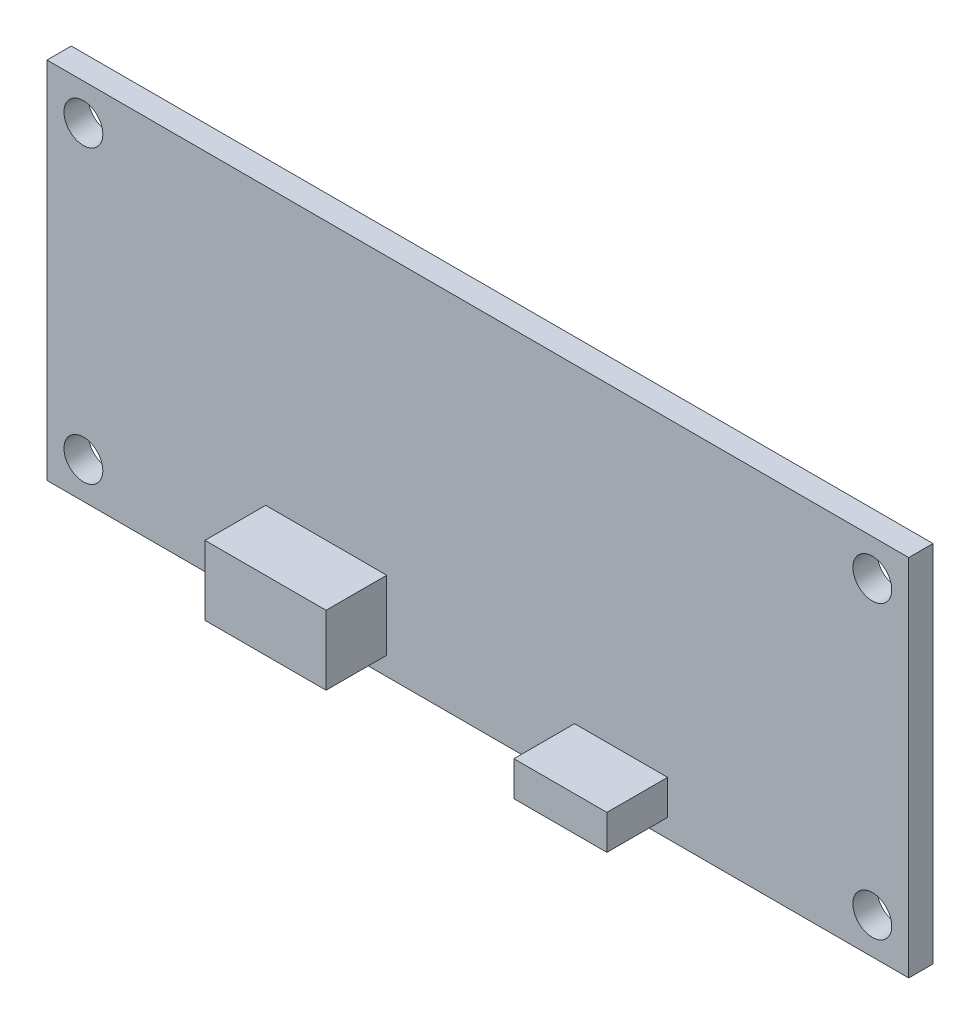
ISO-10303-21;
HEADER;
FILE_DESCRIPTION(('STEP AP214'),'2;1');
FILE_NAME('part.step','',(''),(''),'','','');
FILE_SCHEMA(('AUTOMOTIVE_DESIGN { 1 0 10303 214 1 1 1 1 }'));
ENDSEC;
DATA;
#1=APPLICATION_CONTEXT('core data for automotive mechanical design processes');
#2=APPLICATION_PROTOCOL_DEFINITION('international standard','automotive_design',2000,#1);
#3=PRODUCT_CONTEXT('',#1,'mechanical');
#4=PRODUCT('Part','Part','',(#3));
#5=PRODUCT_RELATED_PRODUCT_CATEGORY('part','',(#4));
#6=PRODUCT_DEFINITION_FORMATION('','',#4);
#7=PRODUCT_DEFINITION_CONTEXT('part definition',#1,'design');
#8=PRODUCT_DEFINITION('design','',#6,#7);
#9=PRODUCT_DEFINITION_SHAPE('','',#8);
#10=(LENGTH_UNIT() NAMED_UNIT(*) SI_UNIT(.MILLI.,.METRE.));
#11=(NAMED_UNIT(*) PLANE_ANGLE_UNIT() SI_UNIT($,.RADIAN.));
#12=(NAMED_UNIT(*) SI_UNIT($,.STERADIAN.) SOLID_ANGLE_UNIT());
#13=UNCERTAINTY_MEASURE_WITH_UNIT(LENGTH_MEASURE(1.E-05),#10,'distance_accuracy_value','');
#14=(GEOMETRIC_REPRESENTATION_CONTEXT(3) GLOBAL_UNCERTAINTY_ASSIGNED_CONTEXT((#13)) GLOBAL_UNIT_ASSIGNED_CONTEXT((#10,
#11,#12)) REPRESENTATION_CONTEXT('',''));
#15=CARTESIAN_POINT('',(0.,0.,0.));
#16=DIRECTION('',(0.,0.,1.));
#17=DIRECTION('',(1.,0.,0.));
#18=AXIS2_PLACEMENT_3D('',#15,#16,#17);
#19=CARTESIAN_POINT('',(0.,0.,2.));
#20=DIRECTION('',(0.,0.,-1.));
#21=DIRECTION('',(-1.,0.,0.));
#22=AXIS2_PLACEMENT_3D('',#19,#20,#21);
#23=PLANE('',#22);
#24=DIRECTION('',(0.,-1.,0.));
#25=VECTOR('',#24,1.);
#26=CARTESIAN_POINT('',(18.0168598681884,7.23542894146016,2.));
#27=LINE('',#26,#25);
#28=CARTESIAN_POINT('',(18.0168598681884,7.23542894146016,2.));
#29=VERTEX_POINT('',#28);
#30=CARTESIAN_POINT('',(18.0168598681884,1.52769789842756,2.));
#31=VERTEX_POINT('',#30);
#32=EDGE_CURVE('E155',#29,#31,#27,.T.);
#33=ORIENTED_EDGE('',*,*,#32,.F.);
#34=DIRECTION('',(-1.,0.,0.));
#35=VECTOR('',#34,1.);
#36=CARTESIAN_POINT('',(18.0168598681884,7.23542894146016,2.));
#37=LINE('',#36,#35);
#38=CARTESIAN_POINT('',(27.9925339433986,7.23542894146016,2.));
#39=VERTEX_POINT('',#38);
#40=EDGE_CURVE('E171',#39,#29,#37,.T.);
#41=ORIENTED_EDGE('',*,*,#40,.F.);
#42=DIRECTION('',(0.,1.,0.));
#43=VECTOR('',#42,1.);
#44=CARTESIAN_POINT('',(27.9925339433986,7.23542894146016,2.));
#45=LINE('',#44,#43);
#46=CARTESIAN_POINT('',(27.9925339433986,1.52769789842756,2.));
#47=VERTEX_POINT('',#46);
#48=EDGE_CURVE('E184',#47,#39,#45,.T.);
#49=ORIENTED_EDGE('',*,*,#48,.F.);
#50=DIRECTION('',(1.,0.,0.));
#51=VECTOR('',#50,1.);
#52=CARTESIAN_POINT('',(18.0168598681884,1.52769789842756,2.));
#53=LINE('',#52,#51);
#54=EDGE_CURVE('E160',#31,#47,#53,.T.);
#55=ORIENTED_EDGE('',*,*,#54,.F.);
#56=EDGE_LOOP('',(#33,#41,#49,#55));
#57=FACE_BOUND('',#56,.T.);
#58=DIRECTION('',(0.,-1.,0.));
#59=VECTOR('',#58,1.);
#60=CARTESIAN_POINT('',(0.,0.,2.));
#61=LINE('',#60,#59);
#62=CARTESIAN_POINT('',(0.,30.,2.));
#63=VERTEX_POINT('',#62);
#64=CARTESIAN_POINT('',(0.,0.,2.));
#65=VERTEX_POINT('',#64);
#66=EDGE_CURVE('E239',#63,#65,#61,.T.);
#67=ORIENTED_EDGE('',*,*,#66,.T.);
#68=DIRECTION('',(1.,0.,0.));
#69=VECTOR('',#68,1.);
#70=CARTESIAN_POINT('',(0.,0.,2.));
#71=LINE('',#70,#69);
#72=CARTESIAN_POINT('',(71.,0.,2.));
#73=VERTEX_POINT('',#72);
#74=EDGE_CURVE('E243',#65,#73,#71,.T.);
#75=ORIENTED_EDGE('',*,*,#74,.T.);
#76=DIRECTION('',(0.,1.,0.));
#77=VECTOR('',#76,1.);
#78=CARTESIAN_POINT('',(71.,0.,2.));
#79=LINE('',#78,#77);
#80=CARTESIAN_POINT('',(71.,30.,2.));
#81=VERTEX_POINT('',#80);
#82=EDGE_CURVE('E247',#73,#81,#79,.T.);
#83=ORIENTED_EDGE('',*,*,#82,.T.);
#84=DIRECTION('',(-1.,0.,0.));
#85=VECTOR('',#84,1.);
#86=CARTESIAN_POINT('',(0.,30.,2.));
#87=LINE('',#86,#85);
#88=EDGE_CURVE('E250',#81,#63,#87,.T.);
#89=ORIENTED_EDGE('',*,*,#88,.T.);
#90=EDGE_LOOP('',(#67,#75,#83,#89));
#91=FACE_BOUND('',#90,.T.);
#92=CARTESIAN_POINT('',(3.,27.,2.));
#93=DIRECTION('',(0.,0.,1.));
#94=DIRECTION('',(1.,0.,0.));
#95=AXIS2_PLACEMENT_3D('',#92,#93,#94);
#96=CIRCLE('',#95,1.6);
#97=CARTESIAN_POINT('',(4.6,27.,2.));
#98=VERTEX_POINT('',#97);
#99=EDGE_CURVE('E231',#98,#98,#96,.T.);
#100=ORIENTED_EDGE('',*,*,#99,.F.);
#101=EDGE_LOOP('',(#100));
#102=FACE_BOUND('',#101,.T.);
#103=CARTESIAN_POINT('',(68.,3.,2.));
#104=DIRECTION('',(0.,0.,1.));
#105=DIRECTION('',(1.,0.,0.));
#106=AXIS2_PLACEMENT_3D('',#103,#104,#105);
#107=CIRCLE('',#106,1.60000000000001);
#108=CARTESIAN_POINT('',(69.6,3.,2.));
#109=VERTEX_POINT('',#108);
#110=EDGE_CURVE('E223',#109,#109,#107,.T.);
#111=ORIENTED_EDGE('',*,*,#110,.F.);
#112=EDGE_LOOP('',(#111));
#113=FACE_BOUND('',#112,.T.);
#114=CARTESIAN_POINT('',(3.,3.,2.));
#115=DIRECTION('',(0.,0.,1.));
#116=DIRECTION('',(1.,0.,0.));
#117=AXIS2_PLACEMENT_3D('',#114,#115,#116);
#118=CIRCLE('',#117,1.6);
#119=CARTESIAN_POINT('',(4.6,3.,2.));
#120=VERTEX_POINT('',#119);
#121=EDGE_CURVE('E215',#120,#120,#118,.T.);
#122=ORIENTED_EDGE('',*,*,#121,.F.);
#123=EDGE_LOOP('',(#122));
#124=FACE_BOUND('',#123,.T.);
#125=CARTESIAN_POINT('',(68.,27.,2.));
#126=DIRECTION('',(0.,0.,1.));
#127=DIRECTION('',(1.,0.,0.));
#128=AXIS2_PLACEMENT_3D('',#125,#126,#127);
#129=CIRCLE('',#128,1.6);
#130=CARTESIAN_POINT('',(69.6,27.,2.));
#131=VERTEX_POINT('',#130);
#132=EDGE_CURVE('E207',#131,#131,#129,.T.);
#133=ORIENTED_EDGE('',*,*,#132,.F.);
#134=EDGE_LOOP('',(#133));
#135=FACE_BOUND('',#134,.T.);
#136=DIRECTION('',(0.,-1.,0.));
#137=VECTOR('',#136,1.);
#138=CARTESIAN_POINT('',(43.4702550600906,4.38156341994386,2.));
#139=LINE('',#138,#137);
#140=CARTESIAN_POINT('',(43.4702550600906,4.38156341994386,2.));
#141=VERTEX_POINT('',#140);
#142=CARTESIAN_POINT('',(43.4702550600906,1.52769789842756,2.));
#143=VERTEX_POINT('',#142);
#144=EDGE_CURVE('E153',#141,#143,#139,.T.);
#145=ORIENTED_EDGE('',*,*,#144,.F.);
#146=DIRECTION('',(-1.,0.,0.));
#147=VECTOR('',#146,1.);
#148=CARTESIAN_POINT('',(43.4702550600906,4.38156341994386,2.));
#149=LINE('',#148,#147);
#150=CARTESIAN_POINT('',(51.131984117855,4.38156341994386,2.));
#151=VERTEX_POINT('',#150);
#152=EDGE_CURVE('E150',#151,#141,#149,.T.);
#153=ORIENTED_EDGE('',*,*,#152,.F.);
#154=DIRECTION('',(0.,1.,0.));
#155=VECTOR('',#154,1.);
#156=CARTESIAN_POINT('',(51.131984117855,4.38156341994386,2.));
#157=LINE('',#156,#155);
#158=CARTESIAN_POINT('',(51.131984117855,1.52769789842756,2.));
#159=VERTEX_POINT('',#158);
#160=EDGE_CURVE('E62',#159,#151,#157,.T.);
#161=ORIENTED_EDGE('',*,*,#160,.F.);
#162=DIRECTION('',(1.,0.,0.));
#163=VECTOR('',#162,1.);
#164=CARTESIAN_POINT('',(43.4702550600906,1.52769789842756,2.));
#165=LINE('',#164,#163);
#166=EDGE_CURVE('E57',#143,#159,#165,.T.);
#167=ORIENTED_EDGE('',*,*,#166,.F.);
#168=EDGE_LOOP('',(#145,#153,#161,#167));
#169=FACE_BOUND('',#168,.T.);
#170=ADVANCED_FACE('F41',(#57,#91,#102,#113,#124,#135,#169),#23,.F.);
#171=CARTESIAN_POINT('',(0.,0.,0.));
#172=DIRECTION('',(0.,0.,-1.));
#173=DIRECTION('',(-1.,0.,0.));
#174=AXIS2_PLACEMENT_3D('',#171,#172,#173);
#175=PLANE('',#174);
#176=CARTESIAN_POINT('',(3.,3.,0.));
#177=DIRECTION('',(0.,0.,1.));
#178=DIRECTION('',(1.,0.,0.));
#179=AXIS2_PLACEMENT_3D('',#176,#177,#178);
#180=CIRCLE('',#179,1.6);
#181=CARTESIAN_POINT('',(4.6,3.,0.));
#182=VERTEX_POINT('',#181);
#183=EDGE_CURVE('E211',#182,#182,#180,.T.);
#184=ORIENTED_EDGE('',*,*,#183,.T.);
#185=EDGE_LOOP('',(#184));
#186=FACE_BOUND('',#185,.T.);
#187=CARTESIAN_POINT('',(3.,27.,0.));
#188=DIRECTION('',(0.,0.,1.));
#189=DIRECTION('',(1.,0.,0.));
#190=AXIS2_PLACEMENT_3D('',#187,#188,#189);
#191=CIRCLE('',#190,1.6);
#192=CARTESIAN_POINT('',(4.6,27.,0.));
#193=VERTEX_POINT('',#192);
#194=EDGE_CURVE('E227',#193,#193,#191,.T.);
#195=ORIENTED_EDGE('',*,*,#194,.T.);
#196=EDGE_LOOP('',(#195));
#197=FACE_BOUND('',#196,.T.);
#198=DIRECTION('',(0.,-1.,0.));
#199=VECTOR('',#198,1.);
#200=CARTESIAN_POINT('',(0.,0.,0.));
#201=LINE('',#200,#199);
#202=CARTESIAN_POINT('',(0.,30.,0.));
#203=VERTEX_POINT('',#202);
#204=CARTESIAN_POINT('',(0.,0.,0.));
#205=VERTEX_POINT('',#204);
#206=EDGE_CURVE('E235',#203,#205,#201,.T.);
#207=ORIENTED_EDGE('',*,*,#206,.F.);
#208=DIRECTION('',(-1.,0.,0.));
#209=VECTOR('',#208,1.);
#210=CARTESIAN_POINT('',(0.,30.,0.));
#211=LINE('',#210,#209);
#212=CARTESIAN_POINT('',(71.,30.,0.));
#213=VERTEX_POINT('',#212);
#214=EDGE_CURVE('E244',#213,#203,#211,.T.);
#215=ORIENTED_EDGE('',*,*,#214,.F.);
#216=DIRECTION('',(0.,1.,0.));
#217=VECTOR('',#216,1.);
#218=CARTESIAN_POINT('',(71.,0.,0.));
#219=LINE('',#218,#217);
#220=CARTESIAN_POINT('',(71.,0.,0.));
#221=VERTEX_POINT('',#220);
#222=EDGE_CURVE('E260',#221,#213,#219,.T.);
#223=ORIENTED_EDGE('',*,*,#222,.F.);
#224=DIRECTION('',(1.,0.,0.));
#225=VECTOR('',#224,1.);
#226=CARTESIAN_POINT('',(0.,0.,0.));
#227=LINE('',#226,#225);
#228=EDGE_CURVE('E257',#205,#221,#227,.T.);
#229=ORIENTED_EDGE('',*,*,#228,.F.);
#230=EDGE_LOOP('',(#207,#215,#223,#229));
#231=FACE_BOUND('',#230,.T.);
#232=CARTESIAN_POINT('',(68.,3.,0.));
#233=DIRECTION('',(0.,0.,1.));
#234=DIRECTION('',(1.,0.,0.));
#235=AXIS2_PLACEMENT_3D('',#232,#233,#234);
#236=CIRCLE('',#235,1.60000000000001);
#237=CARTESIAN_POINT('',(69.6,3.,0.));
#238=VERTEX_POINT('',#237);
#239=EDGE_CURVE('E219',#238,#238,#236,.T.);
#240=ORIENTED_EDGE('',*,*,#239,.T.);
#241=EDGE_LOOP('',(#240));
#242=FACE_BOUND('',#241,.T.);
#243=CARTESIAN_POINT('',(68.,27.,0.));
#244=DIRECTION('',(0.,0.,1.));
#245=DIRECTION('',(1.,0.,0.));
#246=AXIS2_PLACEMENT_3D('',#243,#244,#245);
#247=CIRCLE('',#246,1.6);
#248=CARTESIAN_POINT('',(69.6,27.,0.));
#249=VERTEX_POINT('',#248);
#250=EDGE_CURVE('E206',#249,#249,#247,.T.);
#251=ORIENTED_EDGE('',*,*,#250,.T.);
#252=EDGE_LOOP('',(#251));
#253=FACE_BOUND('',#252,.T.);
#254=ADVANCED_FACE('F283',(#186,#197,#231,#242,#253),#175,.T.);
#255=CARTESIAN_POINT('',(0.,0.,2.));
#256=DIRECTION('',(1.,0.,0.));
#257=DIRECTION('',(0.,0.,-1.));
#258=AXIS2_PLACEMENT_3D('',#255,#256,#257);
#259=PLANE('',#258);
#260=ORIENTED_EDGE('',*,*,#206,.T.);
#261=DIRECTION('',(0.,0.,-1.));
#262=VECTOR('',#261,1.);
#263=CARTESIAN_POINT('',(0.,0.,2.));
#264=LINE('',#263,#262);
#265=EDGE_CURVE('E11',#65,#205,#264,.T.);
#266=ORIENTED_EDGE('',*,*,#265,.F.);
#267=ORIENTED_EDGE('',*,*,#66,.F.);
#268=DIRECTION('',(0.,0.,-1.));
#269=VECTOR('',#268,1.);
#270=CARTESIAN_POINT('',(0.,30.,2.));
#271=LINE('',#270,#269);
#272=EDGE_CURVE('E253',#63,#203,#271,.T.);
#273=ORIENTED_EDGE('',*,*,#272,.T.);
#274=EDGE_LOOP('',(#260,#266,#267,#273));
#275=FACE_BOUND('',#274,.T.);
#276=ADVANCED_FACE('F43',(#275),#259,.F.);
#277=CARTESIAN_POINT('',(0.,0.,2.));
#278=DIRECTION('',(0.,1.,0.));
#279=DIRECTION('',(0.,0.,1.));
#280=AXIS2_PLACEMENT_3D('',#277,#278,#279);
#281=PLANE('',#280);
#282=ORIENTED_EDGE('',*,*,#228,.T.);
#283=DIRECTION('',(0.,0.,-1.));
#284=VECTOR('',#283,1.);
#285=CARTESIAN_POINT('',(71.,0.,2.));
#286=LINE('',#285,#284);
#287=EDGE_CURVE('E50',#73,#221,#286,.T.);
#288=ORIENTED_EDGE('',*,*,#287,.F.);
#289=ORIENTED_EDGE('',*,*,#74,.F.);
#290=ORIENTED_EDGE('',*,*,#265,.T.);
#291=EDGE_LOOP('',(#282,#288,#289,#290));
#292=FACE_BOUND('',#291,.T.);
#293=ADVANCED_FACE('F294',(#292),#281,.F.);
#294=CARTESIAN_POINT('',(71.,0.,2.));
#295=DIRECTION('',(-1.,0.,0.));
#296=DIRECTION('',(0.,0.,1.));
#297=AXIS2_PLACEMENT_3D('',#294,#295,#296);
#298=PLANE('',#297);
#299=ORIENTED_EDGE('',*,*,#222,.T.);
#300=DIRECTION('',(0.,0.,-1.));
#301=VECTOR('',#300,1.);
#302=CARTESIAN_POINT('',(71.,30.,2.));
#303=LINE('',#302,#301);
#304=EDGE_CURVE('E268',#81,#213,#303,.T.);
#305=ORIENTED_EDGE('',*,*,#304,.F.);
#306=ORIENTED_EDGE('',*,*,#82,.F.);
#307=ORIENTED_EDGE('',*,*,#287,.T.);
#308=EDGE_LOOP('',(#299,#305,#306,#307));
#309=FACE_BOUND('',#308,.T.);
#310=ADVANCED_FACE('F277',(#309),#298,.F.);
#311=CARTESIAN_POINT('',(0.,30.,2.));
#312=DIRECTION('',(0.,-1.,0.));
#313=DIRECTION('',(0.,0.,-1.));
#314=AXIS2_PLACEMENT_3D('',#311,#312,#313);
#315=PLANE('',#314);
#316=ORIENTED_EDGE('',*,*,#214,.T.);
#317=ORIENTED_EDGE('',*,*,#272,.F.);
#318=ORIENTED_EDGE('',*,*,#88,.F.);
#319=ORIENTED_EDGE('',*,*,#304,.T.);
#320=EDGE_LOOP('',(#316,#317,#318,#319));
#321=FACE_BOUND('',#320,.T.);
#322=ADVANCED_FACE('F287',(#321),#315,.F.);
#323=CARTESIAN_POINT('',(3.,27.,2.));
#324=DIRECTION('',(0.,0.,-1.));
#325=DIRECTION('',(-1.,0.,0.));
#326=AXIS2_PLACEMENT_3D('',#323,#324,#325);
#327=CYLINDRICAL_SURFACE('',#326,1.6);
#328=ORIENTED_EDGE('',*,*,#99,.T.);
#329=EDGE_LOOP('',(#328));
#330=FACE_BOUND('',#329,.T.);
#331=ORIENTED_EDGE('',*,*,#194,.F.);
#332=EDGE_LOOP('',(#331));
#333=FACE_BOUND('',#332,.T.);
#334=ADVANCED_FACE('F310',(#330,#333),#327,.F.);
#335=CARTESIAN_POINT('',(68.,3.,2.));
#336=DIRECTION('',(0.,0.,-1.));
#337=DIRECTION('',(-1.,0.,0.));
#338=AXIS2_PLACEMENT_3D('',#335,#336,#337);
#339=CYLINDRICAL_SURFACE('',#338,1.60000000000001);
#340=ORIENTED_EDGE('',*,*,#110,.T.);
#341=EDGE_LOOP('',(#340));
#342=FACE_BOUND('',#341,.T.);
#343=ORIENTED_EDGE('',*,*,#239,.F.);
#344=EDGE_LOOP('',(#343));
#345=FACE_BOUND('',#344,.T.);
#346=ADVANCED_FACE('F317',(#342,#345),#339,.F.);
#347=CARTESIAN_POINT('',(3.,3.,2.));
#348=DIRECTION('',(0.,0.,-1.));
#349=DIRECTION('',(-1.,0.,0.));
#350=AXIS2_PLACEMENT_3D('',#347,#348,#349);
#351=CYLINDRICAL_SURFACE('',#350,1.6);
#352=ORIENTED_EDGE('',*,*,#121,.T.);
#353=EDGE_LOOP('',(#352));
#354=FACE_BOUND('',#353,.T.);
#355=ORIENTED_EDGE('',*,*,#183,.F.);
#356=EDGE_LOOP('',(#355));
#357=FACE_BOUND('',#356,.T.);
#358=ADVANCED_FACE('F322',(#354,#357),#351,.F.);
#359=CARTESIAN_POINT('',(68.,27.,2.));
#360=DIRECTION('',(0.,0.,-1.));
#361=DIRECTION('',(-1.,0.,0.));
#362=AXIS2_PLACEMENT_3D('',#359,#360,#361);
#363=CYLINDRICAL_SURFACE('',#362,1.6);
#364=ORIENTED_EDGE('',*,*,#132,.T.);
#365=EDGE_LOOP('',(#364));
#366=FACE_BOUND('',#365,.T.);
#367=ORIENTED_EDGE('',*,*,#250,.F.);
#368=EDGE_LOOP('',(#367));
#369=FACE_BOUND('',#368,.T.);
#370=ADVANCED_FACE('F388',(#366,#369),#363,.F.);
#371=CARTESIAN_POINT('',(18.0168598681884,7.23542894146016,7.));
#372=DIRECTION('',(1.,0.,0.));
#373=DIRECTION('',(0.,0.,-1.));
#374=AXIS2_PLACEMENT_3D('',#371,#372,#373);
#375=PLANE('',#374);
#376=ORIENTED_EDGE('',*,*,#32,.T.);
#377=DIRECTION('',(0.,0.,-1.));
#378=VECTOR('',#377,1.);
#379=CARTESIAN_POINT('',(18.0168598681884,1.52769789842756,7.));
#380=LINE('',#379,#378);
#381=CARTESIAN_POINT('',(18.0168598681884,1.52769789842756,7.));
#382=VERTEX_POINT('',#381);
#383=EDGE_CURVE('E202',#382,#31,#380,.T.);
#384=ORIENTED_EDGE('',*,*,#383,.F.);
#385=DIRECTION('',(0.,-1.,0.));
#386=VECTOR('',#385,1.);
#387=CARTESIAN_POINT('',(18.0168598681884,7.23542894146016,7.));
#388=LINE('',#387,#386);
#389=CARTESIAN_POINT('',(18.0168598681884,7.23542894146016,7.));
#390=VERTEX_POINT('',#389);
#391=EDGE_CURVE('E166',#390,#382,#388,.T.);
#392=ORIENTED_EDGE('',*,*,#391,.F.);
#393=DIRECTION('',(0.,0.,-1.));
#394=VECTOR('',#393,1.);
#395=CARTESIAN_POINT('',(18.0168598681884,7.23542894146016,7.));
#396=LINE('',#395,#394);
#397=EDGE_CURVE('E179',#390,#29,#396,.T.);
#398=ORIENTED_EDGE('',*,*,#397,.T.);
#399=EDGE_LOOP('',(#376,#384,#392,#398));
#400=FACE_BOUND('',#399,.T.);
#401=ADVANCED_FACE('F384',(#400),#375,.F.);
#402=CARTESIAN_POINT('',(18.0168598681884,1.52769789842756,7.));
#403=DIRECTION('',(0.,1.,0.));
#404=DIRECTION('',(0.,0.,1.));
#405=AXIS2_PLACEMENT_3D('',#402,#403,#404);
#406=PLANE('',#405);
#407=ORIENTED_EDGE('',*,*,#54,.T.);
#408=DIRECTION('',(0.,0.,-1.));
#409=VECTOR('',#408,1.);
#410=CARTESIAN_POINT('',(27.9925339433986,1.52769789842756,7.));
#411=LINE('',#410,#409);
#412=CARTESIAN_POINT('',(27.9925339433986,1.52769789842756,7.));
#413=VERTEX_POINT('',#412);
#414=EDGE_CURVE('E198',#413,#47,#411,.T.);
#415=ORIENTED_EDGE('',*,*,#414,.F.);
#416=DIRECTION('',(1.,0.,0.));
#417=VECTOR('',#416,1.);
#418=CARTESIAN_POINT('',(18.0168598681884,1.52769789842756,7.));
#419=LINE('',#418,#417);
#420=EDGE_CURVE('E170',#382,#413,#419,.T.);
#421=ORIENTED_EDGE('',*,*,#420,.F.);
#422=ORIENTED_EDGE('',*,*,#383,.T.);
#423=EDGE_LOOP('',(#407,#415,#421,#422));
#424=FACE_BOUND('',#423,.T.);
#425=ADVANCED_FACE('F380',(#424),#406,.F.);
#426=CARTESIAN_POINT('',(27.9925339433986,7.23542894146016,7.));
#427=DIRECTION('',(-1.,0.,0.));
#428=DIRECTION('',(0.,0.,1.));
#429=AXIS2_PLACEMENT_3D('',#426,#427,#428);
#430=PLANE('',#429);
#431=ORIENTED_EDGE('',*,*,#48,.T.);
#432=DIRECTION('',(0.,0.,-1.));
#433=VECTOR('',#432,1.);
#434=CARTESIAN_POINT('',(27.9925339433986,7.23542894146016,7.));
#435=LINE('',#434,#433);
#436=CARTESIAN_POINT('',(27.9925339433986,7.23542894146016,7.));
#437=VERTEX_POINT('',#436);
#438=EDGE_CURVE('E194',#437,#39,#435,.T.);
#439=ORIENTED_EDGE('',*,*,#438,.F.);
#440=DIRECTION('',(0.,1.,0.));
#441=VECTOR('',#440,1.);
#442=CARTESIAN_POINT('',(27.9925339433986,7.23542894146016,7.));
#443=LINE('',#442,#441);
#444=EDGE_CURVE('E174',#413,#437,#443,.T.);
#445=ORIENTED_EDGE('',*,*,#444,.F.);
#446=ORIENTED_EDGE('',*,*,#414,.T.);
#447=EDGE_LOOP('',(#431,#439,#445,#446));
#448=FACE_BOUND('',#447,.T.);
#449=ADVANCED_FACE('F376',(#448),#430,.F.);
#450=CARTESIAN_POINT('',(18.0168598681884,7.23542894146016,7.));
#451=DIRECTION('',(0.,-1.,0.));
#452=DIRECTION('',(0.,0.,-1.));
#453=AXIS2_PLACEMENT_3D('',#450,#451,#452);
#454=PLANE('',#453);
#455=ORIENTED_EDGE('',*,*,#40,.T.);
#456=ORIENTED_EDGE('',*,*,#397,.F.);
#457=DIRECTION('',(-1.,0.,0.));
#458=VECTOR('',#457,1.);
#459=CARTESIAN_POINT('',(18.0168598681884,7.23542894146016,7.));
#460=LINE('',#459,#458);
#461=EDGE_CURVE('E177',#437,#390,#460,.T.);
#462=ORIENTED_EDGE('',*,*,#461,.F.);
#463=ORIENTED_EDGE('',*,*,#438,.T.);
#464=EDGE_LOOP('',(#455,#456,#462,#463));
#465=FACE_BOUND('',#464,.T.);
#466=ADVANCED_FACE('F372',(#465),#454,.F.);
#467=CARTESIAN_POINT('',(0.,0.,7.));
#468=DIRECTION('',(0.,0.,1.));
#469=DIRECTION('',(1.,0.,0.));
#470=AXIS2_PLACEMENT_3D('',#467,#468,#469);
#471=PLANE('',#470);
#472=ORIENTED_EDGE('',*,*,#391,.T.);
#473=ORIENTED_EDGE('',*,*,#420,.T.);
#474=ORIENTED_EDGE('',*,*,#444,.T.);
#475=ORIENTED_EDGE('',*,*,#461,.T.);
#476=EDGE_LOOP('',(#472,#473,#474,#475));
#477=FACE_BOUND('',#476,.T.);
#478=ADVANCED_FACE('F369',(#477),#471,.T.);
#479=CARTESIAN_POINT('',(43.4702550600906,4.38156341994386,7.));
#480=DIRECTION('',(1.,0.,0.));
#481=DIRECTION('',(0.,0.,-1.));
#482=AXIS2_PLACEMENT_3D('',#479,#480,#481);
#483=PLANE('',#482);
#484=ORIENTED_EDGE('',*,*,#144,.T.);
#485=DIRECTION('',(0.,0.,-1.));
#486=VECTOR('',#485,1.);
#487=CARTESIAN_POINT('',(43.4702550600906,1.52769789842756,7.));
#488=LINE('',#487,#486);
#489=CARTESIAN_POINT('',(43.4702550600906,1.52769789842756,7.));
#490=VERTEX_POINT('',#489);
#491=EDGE_CURVE('E132',#490,#143,#488,.T.);
#492=ORIENTED_EDGE('',*,*,#491,.F.);
#493=DIRECTION('',(0.,-1.,0.));
#494=VECTOR('',#493,1.);
#495=CARTESIAN_POINT('',(43.4702550600906,4.38156341994386,7.));
#496=LINE('',#495,#494);
#497=CARTESIAN_POINT('',(43.4702550600906,4.38156341994386,7.));
#498=VERTEX_POINT('',#497);
#499=EDGE_CURVE('E140',#498,#490,#496,.T.);
#500=ORIENTED_EDGE('',*,*,#499,.F.);
#501=DIRECTION('',(0.,0.,-1.));
#502=VECTOR('',#501,1.);
#503=CARTESIAN_POINT('',(43.4702550600906,4.38156341994386,7.));
#504=LINE('',#503,#502);
#505=EDGE_CURVE('E340',#498,#141,#504,.T.);
#506=ORIENTED_EDGE('',*,*,#505,.T.);
#507=EDGE_LOOP('',(#484,#492,#500,#506));
#508=FACE_BOUND('',#507,.T.);
#509=ADVANCED_FACE('F152',(#508),#483,.F.);
#510=CARTESIAN_POINT('',(43.4702550600906,1.52769789842756,7.));
#511=DIRECTION('',(0.,1.,0.));
#512=DIRECTION('',(0.,0.,1.));
#513=AXIS2_PLACEMENT_3D('',#510,#511,#512);
#514=PLANE('',#513);
#515=ORIENTED_EDGE('',*,*,#166,.T.);
#516=DIRECTION('',(0.,0.,-1.));
#517=VECTOR('',#516,1.);
#518=CARTESIAN_POINT('',(51.131984117855,1.52769789842756,7.));
#519=LINE('',#518,#517);
#520=CARTESIAN_POINT('',(51.131984117855,1.52769789842756,7.));
#521=VERTEX_POINT('',#520);
#522=EDGE_CURVE('E135',#521,#159,#519,.T.);
#523=ORIENTED_EDGE('',*,*,#522,.F.);
#524=DIRECTION('',(1.,0.,0.));
#525=VECTOR('',#524,1.);
#526=CARTESIAN_POINT('',(43.4702550600906,1.52769789842756,7.));
#527=LINE('',#526,#525);
#528=EDGE_CURVE('E128',#490,#521,#527,.T.);
#529=ORIENTED_EDGE('',*,*,#528,.F.);
#530=ORIENTED_EDGE('',*,*,#491,.T.);
#531=EDGE_LOOP('',(#515,#523,#529,#530));
#532=FACE_BOUND('',#531,.T.);
#533=ADVANCED_FACE('F130',(#532),#514,.F.);
#534=CARTESIAN_POINT('',(51.131984117855,4.38156341994386,7.));
#535=DIRECTION('',(-1.,0.,0.));
#536=DIRECTION('',(0.,0.,1.));
#537=AXIS2_PLACEMENT_3D('',#534,#535,#536);
#538=PLANE('',#537);
#539=ORIENTED_EDGE('',*,*,#160,.T.);
#540=DIRECTION('',(0.,0.,-1.));
#541=VECTOR('',#540,1.);
#542=CARTESIAN_POINT('',(51.131984117855,4.38156341994386,7.));
#543=LINE('',#542,#541);
#544=CARTESIAN_POINT('',(51.131984117855,4.38156341994386,7.));
#545=VERTEX_POINT('',#544);
#546=EDGE_CURVE('E162',#545,#151,#543,.T.);
#547=ORIENTED_EDGE('',*,*,#546,.F.);
#548=DIRECTION('',(0.,1.,0.));
#549=VECTOR('',#548,1.);
#550=CARTESIAN_POINT('',(51.131984117855,4.38156341994386,7.));
#551=LINE('',#550,#549);
#552=EDGE_CURVE('E139',#521,#545,#551,.T.);
#553=ORIENTED_EDGE('',*,*,#552,.F.);
#554=ORIENTED_EDGE('',*,*,#522,.T.);
#555=EDGE_LOOP('',(#539,#547,#553,#554));
#556=FACE_BOUND('',#555,.T.);
#557=ADVANCED_FACE('F356',(#556),#538,.F.);
#558=CARTESIAN_POINT('',(43.4702550600906,4.38156341994386,7.));
#559=DIRECTION('',(0.,-1.,0.));
#560=DIRECTION('',(0.,0.,-1.));
#561=AXIS2_PLACEMENT_3D('',#558,#559,#560);
#562=PLANE('',#561);
#563=ORIENTED_EDGE('',*,*,#152,.T.);
#564=ORIENTED_EDGE('',*,*,#505,.F.);
#565=DIRECTION('',(-1.,0.,0.));
#566=VECTOR('',#565,1.);
#567=CARTESIAN_POINT('',(43.4702550600906,4.38156341994386,7.));
#568=LINE('',#567,#566);
#569=EDGE_CURVE('E145',#545,#498,#568,.T.);
#570=ORIENTED_EDGE('',*,*,#569,.F.);
#571=ORIENTED_EDGE('',*,*,#546,.T.);
#572=EDGE_LOOP('',(#563,#564,#570,#571));
#573=FACE_BOUND('',#572,.T.);
#574=ADVANCED_FACE('F339',(#573),#562,.F.);
#575=CARTESIAN_POINT('',(0.,0.,7.));
#576=DIRECTION('',(0.,0.,1.));
#577=DIRECTION('',(1.,0.,0.));
#578=AXIS2_PLACEMENT_3D('',#575,#576,#577);
#579=PLANE('',#578);
#580=ORIENTED_EDGE('',*,*,#499,.T.);
#581=ORIENTED_EDGE('',*,*,#528,.T.);
#582=ORIENTED_EDGE('',*,*,#552,.T.);
#583=ORIENTED_EDGE('',*,*,#569,.T.);
#584=EDGE_LOOP('',(#580,#581,#582,#583));
#585=FACE_BOUND('',#584,.T.);
#586=ADVANCED_FACE('F143',(#585),#579,.T.);
#587=CLOSED_SHELL('',(#170,#254,#276,#293,#310,#322,#334,#346,#358,#370,#401,#425,#449,#466,
#478,#509,#533,#557,#574,#586));
#588=MANIFOLD_SOLID_BREP('B2',#587);
#589=ADVANCED_BREP_SHAPE_REPRESENTATION('',(#18,#588),#14);
#590=SHAPE_DEFINITION_REPRESENTATION(#9,#589);
ENDSEC;
END-ISO-10303-21;
